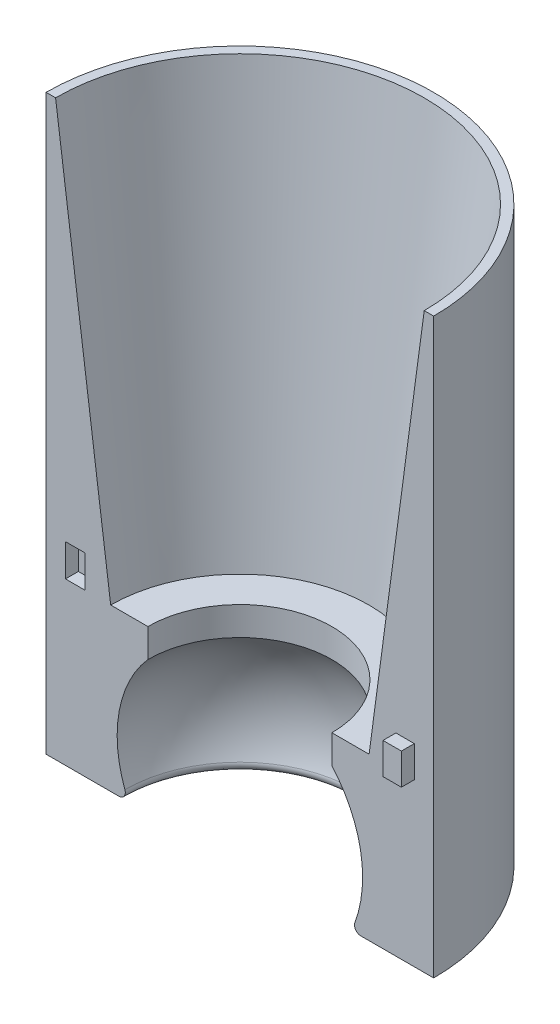
ISO-10303-21;
HEADER;
FILE_DESCRIPTION(('STEP AP214'),'2;1');
FILE_NAME('part.step','',(''),(''),'','','');
FILE_SCHEMA(('AUTOMOTIVE_DESIGN { 1 0 10303 214 1 1 1 1 }'));
ENDSEC;
DATA;
#1=APPLICATION_CONTEXT('core data for automotive mechanical design processes');
#2=APPLICATION_PROTOCOL_DEFINITION('international standard','automotive_design',2000,#1);
#3=PRODUCT_CONTEXT('',#1,'mechanical');
#4=PRODUCT('Part','Part','',(#3));
#5=PRODUCT_RELATED_PRODUCT_CATEGORY('part','',(#4));
#6=PRODUCT_DEFINITION_FORMATION('','',#4);
#7=PRODUCT_DEFINITION_CONTEXT('part definition',#1,'design');
#8=PRODUCT_DEFINITION('design','',#6,#7);
#9=PRODUCT_DEFINITION_SHAPE('','',#8);
#10=(LENGTH_UNIT() NAMED_UNIT(*) SI_UNIT(.MILLI.,.METRE.));
#11=(NAMED_UNIT(*) PLANE_ANGLE_UNIT() SI_UNIT($,.RADIAN.));
#12=(NAMED_UNIT(*) SI_UNIT($,.STERADIAN.) SOLID_ANGLE_UNIT());
#13=UNCERTAINTY_MEASURE_WITH_UNIT(LENGTH_MEASURE(1.E-05),#10,'distance_accuracy_value','');
#14=(GEOMETRIC_REPRESENTATION_CONTEXT(3) GLOBAL_UNCERTAINTY_ASSIGNED_CONTEXT((#13)) GLOBAL_UNIT_ASSIGNED_CONTEXT((#10,
#11,#12)) REPRESENTATION_CONTEXT('',''));
#15=CARTESIAN_POINT('',(0.,0.,0.));
#16=DIRECTION('',(0.,0.,1.));
#17=DIRECTION('',(1.,0.,0.));
#18=AXIS2_PLACEMENT_3D('',#15,#16,#17);
#19=CARTESIAN_POINT('',(-18.2557556450827,0.,0.));
#20=DIRECTION('',(0.,0.,-1.));
#21=DIRECTION('',(-1.,0.,0.));
#22=AXIS2_PLACEMENT_3D('',#19,#20,#21);
#23=PLANE('',#22);
#24=CARTESIAN_POINT('',(-9.12787782254135,-5.79954606428158,0.));
#25=DIRECTION('',(0.,0.,-1.));
#26=DIRECTION('',(-1.,0.,0.));
#27=AXIS2_PLACEMENT_3D('',#24,#25,#26);
#28=CIRCLE('',#27,19.);
#29=CARTESIAN_POINT('',(5.11503764192683,6.77580121012851,0.));
#30=VERTEX_POINT('',#29);
#31=CARTESIAN_POINT('',(8.67036647289408,-12.4495460642816,1.24284475643368E-13));
#32=VERTEX_POINT('',#31);
#33=EDGE_CURVE('E242',#30,#32,#28,.T.);
#34=ORIENTED_EDGE('',*,*,#33,.T.);
#35=CARTESIAN_POINT('',(9.60711617265384,-12.7995460642816,1.30825763835124E-13));
#36=DIRECTION('',(0.,0.,-1.));
#37=DIRECTION('',(-1.,0.,0.));
#38=AXIS2_PLACEMENT_3D('',#35,#36,#37);
#39=CIRCLE('',#38,1.);
#40=CARTESIAN_POINT('',(9.60711617265384,-13.7995460642816,1.30825763835124E-13));
#41=VERTEX_POINT('',#40);
#42=EDGE_CURVE('E11',#32,#41,#39,.F.);
#43=ORIENTED_EDGE('',*,*,#42,.T.);
#44=DIRECTION('',(1.,0.,0.));
#45=VECTOR('',#44,1.);
#46=CARTESIAN_POINT('',(-18.2557556450827,-13.7995460642816,0.));
#47=LINE('',#46,#45);
#48=CARTESIAN_POINT('',(20.8721221774586,-13.7995460642816,2.09488880330588E-13));
#49=VERTEX_POINT('',#48);
#50=EDGE_CURVE('E259',#41,#49,#47,.T.);
#51=ORIENTED_EDGE('',*,*,#50,.T.);
#52=DIRECTION('',(0.,1.,0.));
#53=VECTOR('',#52,1.);
#54=CARTESIAN_POINT('',(20.8721221774586,0.,2.09488880330588E-13));
#55=LINE('',#54,#53);
#56=CARTESIAN_POINT('',(20.8721221774586,74.9367459600028,2.09488880330588E-13));
#57=VERTEX_POINT('',#56);
#58=EDGE_CURVE('E256',#49,#57,#55,.T.);
#59=ORIENTED_EDGE('',*,*,#58,.T.);
#60=DIRECTION('',(1.,0.,0.));
#61=VECTOR('',#60,1.);
#62=CARTESIAN_POINT('',(-18.2557556450827,74.9367459600028,0.));
#63=LINE('',#62,#61);
#64=CARTESIAN_POINT('',(19.404475428781,74.9367459600028,1.99240357860544E-13));
#65=VERTEX_POINT('',#64);
#66=EDGE_CURVE('E253',#65,#57,#63,.T.);
#67=ORIENTED_EDGE('',*,*,#66,.F.);
#68=DIRECTION('',(0.132679417219069,0.991159004522689,0.));
#69=VECTOR('',#68,1.);
#70=CARTESIAN_POINT('',(8.88684958696146,-3.63338780918319,1.2579616914925E-13));
#71=LINE('',#70,#69);
#72=CARTESIAN_POINT('',(10.8725506388136,11.2004539357184,1.39662245483376E-13));
#73=VERTEX_POINT('',#72);
#74=EDGE_CURVE('E250',#73,#65,#71,.T.);
#75=ORIENTED_EDGE('',*,*,#74,.F.);
#76=DIRECTION('',(1.,0.,0.));
#77=VECTOR('',#76,1.);
#78=CARTESIAN_POINT('',(-18.2557556450827,11.2004539357184,0.));
#79=LINE('',#78,#77);
#80=CARTESIAN_POINT('',(5.11503764192682,11.2004539357184,0.));
#81=VERTEX_POINT('',#80);
#82=EDGE_CURVE('E247',#81,#73,#79,.T.);
#83=ORIENTED_EDGE('',*,*,#82,.F.);
#84=DIRECTION('',(0.,-1.,0.));
#85=VECTOR('',#84,1.);
#86=CARTESIAN_POINT('',(5.11503764192683,0.,0.));
#87=LINE('',#86,#85);
#88=EDGE_CURVE('E244',#81,#30,#87,.T.);
#89=ORIENTED_EDGE('',*,*,#88,.T.);
#90=EDGE_LOOP('',(#34,#43,#51,#59,#67,#75,#83,#89));
#91=FACE_BOUND('',#90,.T.);
#92=DIRECTION('',(0.,-1.,0.));
#93=VECTOR('',#92,1.);
#94=CARTESIAN_POINT('',(15.0221221774586,16.1254539357184,0.));
#95=LINE('',#94,#93);
#96=CARTESIAN_POINT('',(15.0221221774586,16.1254539357184,0.));
#97=VERTEX_POINT('',#96);
#98=CARTESIAN_POINT('',(15.0221221774586,11.2754539357184,1.68638548666123E-13));
#99=VERTEX_POINT('',#98);
#100=EDGE_CURVE('E187',#97,#99,#95,.T.);
#101=ORIENTED_EDGE('',*,*,#100,.F.);
#102=DIRECTION('',(-1.,0.,0.));
#103=VECTOR('',#102,1.);
#104=CARTESIAN_POINT('',(15.0221221774586,16.1254539357184,0.));
#105=LINE('',#104,#103);
#106=CARTESIAN_POINT('',(17.8721221774586,16.1254539357184,1.88539992297529E-13));
#107=VERTEX_POINT('',#106);
#108=EDGE_CURVE('E195',#107,#97,#105,.T.);
#109=ORIENTED_EDGE('',*,*,#108,.F.);
#110=DIRECTION('',(0.,1.,0.));
#111=VECTOR('',#110,1.);
#112=CARTESIAN_POINT('',(17.8721221774586,16.1254539357184,0.));
#113=LINE('',#112,#111);
#114=CARTESIAN_POINT('',(17.8721221774586,11.2754539357184,1.88539992297529E-13));
#115=VERTEX_POINT('',#114);
#116=EDGE_CURVE('E207',#115,#107,#113,.T.);
#117=ORIENTED_EDGE('',*,*,#116,.F.);
#118=DIRECTION('',(1.,0.,0.));
#119=VECTOR('',#118,1.);
#120=CARTESIAN_POINT('',(15.0221221774586,11.2754539357184,0.));
#121=LINE('',#120,#119);
#122=EDGE_CURVE('E204',#99,#115,#121,.T.);
#123=ORIENTED_EDGE('',*,*,#122,.F.);
#124=EDGE_LOOP('',(#101,#109,#117,#123));
#125=FACE_BOUND('',#124,.T.);
#126=ADVANCED_FACE('F35',(#91,#125),#23,.F.);
#127=CARTESIAN_POINT('',(-9.12787782254135,-5.79954606428158,0.));
#128=DIRECTION('',(0.,1.,0.));
#129=DIRECTION('',(1.,0.,0.));
#130=AXIS2_PLACEMENT_3D('',#127,#128,#129);
#131=SPHERICAL_SURFACE('',#130,19.);
#132=CARTESIAN_POINT('',(-9.12787782254136,-5.79954606428158,0.));
#133=DIRECTION('',(0.,0.,1.));
#134=DIRECTION('',(1.,0.,0.));
#135=AXIS2_PLACEMENT_3D('',#132,#133,#134);
#136=CIRCLE('',#135,19.);
#137=CARTESIAN_POINT('',(-23.3707932870095,6.77580121012851,0.));
#138=VERTEX_POINT('',#137);
#139=CARTESIAN_POINT('',(-26.9261221179768,-12.4495460642816,0.));
#140=VERTEX_POINT('',#139);
#141=EDGE_CURVE('E223',#138,#140,#136,.T.);
#142=ORIENTED_EDGE('',*,*,#141,.T.);
#143=CARTESIAN_POINT('',(-9.12787782254135,-12.4495460642816,0.));
#144=DIRECTION('',(0.,1.,0.));
#145=DIRECTION('',(-1.,0.,0.));
#146=AXIS2_PLACEMENT_3D('',#143,#144,#145);
#147=CIRCLE('',#146,17.7982442954354);
#148=EDGE_CURVE('E43',#140,#32,#147,.F.);
#149=ORIENTED_EDGE('',*,*,#148,.T.);
#150=ORIENTED_EDGE('',*,*,#33,.F.);
#151=CARTESIAN_POINT('',(-9.12787782254135,6.77580121012851,0.));
#152=DIRECTION('',(0.,1.,0.));
#153=DIRECTION('',(-1.,0.,0.));
#154=AXIS2_PLACEMENT_3D('',#151,#152,#153);
#155=CIRCLE('',#154,14.2429154644682);
#156=EDGE_CURVE('E272',#30,#138,#155,.T.);
#157=ORIENTED_EDGE('',*,*,#156,.T.);
#158=EDGE_LOOP('',(#142,#149,#150,#157));
#159=FACE_BOUND('',#158,.T.);
#160=ADVANCED_FACE('F300',(#159),#131,.F.);
#161=CARTESIAN_POINT('',(-9.12787782254136,95.8584641843645,0.));
#162=DIRECTION('',(0.,1.,0.));
#163=DIRECTION('',(-1.,0.,0.));
#164=AXIS2_PLACEMENT_3D('',#161,#162,#163);
#165=CYLINDRICAL_SURFACE('',#164,14.2429154644682);
#166=CARTESIAN_POINT('',(-9.12787782254135,11.2004539357184,0.));
#167=DIRECTION('',(0.,1.,0.));
#168=DIRECTION('',(-1.,0.,0.));
#169=AXIS2_PLACEMENT_3D('',#166,#167,#168);
#170=CIRCLE('',#169,14.2429154644682);
#171=CARTESIAN_POINT('',(-23.3707932870095,11.2004539357184,0.));
#172=VERTEX_POINT('',#171);
#173=EDGE_CURVE('E270',#81,#172,#170,.T.);
#174=ORIENTED_EDGE('',*,*,#173,.T.);
#175=DIRECTION('',(0.,-1.,0.));
#176=VECTOR('',#175,1.);
#177=CARTESIAN_POINT('',(-23.3707932870095,0.,0.));
#178=LINE('',#177,#176);
#179=EDGE_CURVE('E225',#172,#138,#178,.T.);
#180=ORIENTED_EDGE('',*,*,#179,.T.);
#181=ORIENTED_EDGE('',*,*,#156,.F.);
#182=ORIENTED_EDGE('',*,*,#88,.F.);
#183=EDGE_LOOP('',(#174,#180,#181,#182));
#184=FACE_BOUND('',#183,.T.);
#185=ADVANCED_FACE('F305',(#184),#165,.F.);
#186=CARTESIAN_POINT('',(-18.2557556450827,11.2004539357184,0.));
#187=DIRECTION('',(0.,1.,0.));
#188=DIRECTION('',(-1.,0.,0.));
#189=AXIS2_PLACEMENT_3D('',#186,#187,#188);
#190=PLANE('',#189);
#191=CARTESIAN_POINT('',(-9.12787782254135,11.2004539357184,0.));
#192=DIRECTION('',(0.,1.,0.));
#193=DIRECTION('',(-1.,0.,0.));
#194=AXIS2_PLACEMENT_3D('',#191,#192,#193);
#195=CIRCLE('',#194,20.000428461355);
#196=CARTESIAN_POINT('',(-29.1283062838963,11.2004539357184,0.));
#197=VERTEX_POINT('',#196);
#198=EDGE_CURVE('E268',#73,#197,#195,.T.);
#199=ORIENTED_EDGE('',*,*,#198,.T.);
#200=DIRECTION('',(-1.,0.,0.));
#201=VECTOR('',#200,1.);
#202=CARTESIAN_POINT('',(0.,11.2004539357184,0.));
#203=LINE('',#202,#201);
#204=EDGE_CURVE('E228',#172,#197,#203,.T.);
#205=ORIENTED_EDGE('',*,*,#204,.F.);
#206=ORIENTED_EDGE('',*,*,#173,.F.);
#207=ORIENTED_EDGE('',*,*,#82,.T.);
#208=EDGE_LOOP('',(#199,#205,#206,#207));
#209=FACE_BOUND('',#208,.T.);
#210=ADVANCED_FACE('F321',(#209),#190,.T.);
#211=CARTESIAN_POINT('',(-9.12787782254135,11.2004539357184,0.));
#212=DIRECTION('',(0.,1.,0.));
#213=DIRECTION('',(-1.,0.,0.));
#214=AXIS2_PLACEMENT_3D('',#211,#212,#213);
#215=CONICAL_SURFACE('',#214,20.000428461355,0.133071811274571);
#216=CARTESIAN_POINT('',(-9.12787782254136,74.9367459600028,0.));
#217=DIRECTION('',(0.,1.,0.));
#218=DIRECTION('',(-1.,0.,0.));
#219=AXIS2_PLACEMENT_3D('',#216,#217,#218);
#220=CIRCLE('',#219,28.5323532513223);
#221=CARTESIAN_POINT('',(-37.6602310738637,74.9367459600028,0.));
#222=VERTEX_POINT('',#221);
#223=EDGE_CURVE('E266',#65,#222,#220,.T.);
#224=ORIENTED_EDGE('',*,*,#223,.T.);
#225=DIRECTION('',(-0.13267941721907,0.991159004522689,0.));
#226=VECTOR('',#225,1.);
#227=CARTESIAN_POINT('',(-27.1426052320442,-3.63338780918319,0.));
#228=LINE('',#227,#226);
#229=EDGE_CURVE('E231',#197,#222,#228,.T.);
#230=ORIENTED_EDGE('',*,*,#229,.F.);
#231=ORIENTED_EDGE('',*,*,#198,.F.);
#232=ORIENTED_EDGE('',*,*,#74,.T.);
#233=EDGE_LOOP('',(#224,#230,#231,#232));
#234=FACE_BOUND('',#233,.T.);
#235=ADVANCED_FACE('F317',(#234),#215,.F.);
#236=CARTESIAN_POINT('',(-18.2557556450827,74.9367459600028,0.));
#237=DIRECTION('',(0.,1.,0.));
#238=DIRECTION('',(-1.,0.,0.));
#239=AXIS2_PLACEMENT_3D('',#236,#237,#238);
#240=PLANE('',#239);
#241=CARTESIAN_POINT('',(-9.12787782254136,74.9367459600028,0.));
#242=DIRECTION('',(0.,1.,0.));
#243=DIRECTION('',(-1.,0.,0.));
#244=AXIS2_PLACEMENT_3D('',#241,#242,#243);
#245=CIRCLE('',#244,30.);
#246=CARTESIAN_POINT('',(-39.1278778225414,74.9367459600028,0.));
#247=VERTEX_POINT('',#246);
#248=EDGE_CURVE('E264',#57,#247,#245,.T.);
#249=ORIENTED_EDGE('',*,*,#248,.T.);
#250=DIRECTION('',(-1.,0.,0.));
#251=VECTOR('',#250,1.);
#252=CARTESIAN_POINT('',(0.,74.9367459600028,0.));
#253=LINE('',#252,#251);
#254=EDGE_CURVE('E234',#222,#247,#253,.T.);
#255=ORIENTED_EDGE('',*,*,#254,.F.);
#256=ORIENTED_EDGE('',*,*,#223,.F.);
#257=ORIENTED_EDGE('',*,*,#66,.T.);
#258=EDGE_LOOP('',(#249,#255,#256,#257));
#259=FACE_BOUND('',#258,.T.);
#260=ADVANCED_FACE('F314',(#259),#240,.T.);
#261=CARTESIAN_POINT('',(-9.12787782254136,95.8584641843645,0.));
#262=DIRECTION('',(0.,1.,0.));
#263=DIRECTION('',(-1.,0.,0.));
#264=AXIS2_PLACEMENT_3D('',#261,#262,#263);
#265=CYLINDRICAL_SURFACE('',#264,30.);
#266=CARTESIAN_POINT('',(-9.12787782254135,-13.7995460642816,0.));
#267=DIRECTION('',(0.,1.,0.));
#268=DIRECTION('',(-1.,0.,0.));
#269=AXIS2_PLACEMENT_3D('',#266,#267,#268);
#270=CIRCLE('',#269,30.);
#271=CARTESIAN_POINT('',(-39.1278778225414,-13.7995460642816,0.));
#272=VERTEX_POINT('',#271);
#273=EDGE_CURVE('E261',#49,#272,#270,.T.);
#274=ORIENTED_EDGE('',*,*,#273,.T.);
#275=DIRECTION('',(0.,1.,0.));
#276=VECTOR('',#275,1.);
#277=CARTESIAN_POINT('',(-39.1278778225414,0.,0.));
#278=LINE('',#277,#276);
#279=EDGE_CURVE('E237',#272,#247,#278,.T.);
#280=ORIENTED_EDGE('',*,*,#279,.T.);
#281=ORIENTED_EDGE('',*,*,#248,.F.);
#282=ORIENTED_EDGE('',*,*,#58,.F.);
#283=EDGE_LOOP('',(#274,#280,#281,#282));
#284=FACE_BOUND('',#283,.T.);
#285=ADVANCED_FACE('F288',(#284),#265,.T.);
#286=CARTESIAN_POINT('',(-18.2557556450827,-13.7995460642816,0.));
#287=DIRECTION('',(0.,1.,0.));
#288=DIRECTION('',(-1.,0.,0.));
#289=AXIS2_PLACEMENT_3D('',#286,#287,#288);
#290=PLANE('',#289);
#291=ORIENTED_EDGE('',*,*,#50,.F.);
#292=CARTESIAN_POINT('',(-9.12787782254135,-13.7995460642816,0.));
#293=DIRECTION('',(0.,1.,0.));
#294=DIRECTION('',(-1.,0.,0.));
#295=AXIS2_PLACEMENT_3D('',#292,#293,#294);
#296=CIRCLE('',#295,18.7349939951952);
#297=CARTESIAN_POINT('',(-27.8628718177365,-13.7995460642816,0.));
#298=VERTEX_POINT('',#297);
#299=EDGE_CURVE('E274',#41,#298,#296,.T.);
#300=ORIENTED_EDGE('',*,*,#299,.T.);
#301=DIRECTION('',(-1.,0.,0.));
#302=VECTOR('',#301,1.);
#303=CARTESIAN_POINT('',(0.,-13.7995460642816,0.));
#304=LINE('',#303,#302);
#305=EDGE_CURVE('E240',#298,#272,#304,.T.);
#306=ORIENTED_EDGE('',*,*,#305,.T.);
#307=ORIENTED_EDGE('',*,*,#273,.F.);
#308=EDGE_LOOP('',(#291,#300,#306,#307));
#309=FACE_BOUND('',#308,.T.);
#310=ADVANCED_FACE('F280',(#309),#290,.F.);
#311=CARTESIAN_POINT('',(0.,0.,0.));
#312=DIRECTION('',(0.,0.,1.));
#313=DIRECTION('',(1.,0.,0.));
#314=AXIS2_PLACEMENT_3D('',#311,#312,#313);
#315=PLANE('',#314);
#316=DIRECTION('',(0.,-1.,0.));
#317=VECTOR('',#316,1.);
#318=CARTESIAN_POINT('',(-36.1278778225414,16.2004539357184,0.));
#319=LINE('',#318,#317);
#320=CARTESIAN_POINT('',(-36.1278778225414,16.2004539357184,0.));
#321=VERTEX_POINT('',#320);
#322=CARTESIAN_POINT('',(-36.1278778225414,11.2004539357184,0.));
#323=VERTEX_POINT('',#322);
#324=EDGE_CURVE('E155',#321,#323,#319,.T.);
#325=ORIENTED_EDGE('',*,*,#324,.F.);
#326=DIRECTION('',(-1.,0.,0.));
#327=VECTOR('',#326,1.);
#328=CARTESIAN_POINT('',(-36.1278778225414,16.2004539357184,0.));
#329=LINE('',#328,#327);
#330=CARTESIAN_POINT('',(-33.1278778225414,16.2004539357184,0.));
#331=VERTEX_POINT('',#330);
#332=EDGE_CURVE('E172',#331,#321,#329,.T.);
#333=ORIENTED_EDGE('',*,*,#332,.F.);
#334=DIRECTION('',(0.,1.,0.));
#335=VECTOR('',#334,1.);
#336=CARTESIAN_POINT('',(-33.1278778225414,16.2004539357184,0.));
#337=LINE('',#336,#335);
#338=CARTESIAN_POINT('',(-33.1278778225414,11.2004539357184,0.));
#339=VERTEX_POINT('',#338);
#340=EDGE_CURVE('E175',#339,#331,#337,.T.);
#341=ORIENTED_EDGE('',*,*,#340,.F.);
#342=DIRECTION('',(1.,0.,0.));
#343=VECTOR('',#342,1.);
#344=CARTESIAN_POINT('',(-36.1278778225414,11.2004539357184,0.));
#345=LINE('',#344,#343);
#346=EDGE_CURVE('E181',#323,#339,#345,.T.);
#347=ORIENTED_EDGE('',*,*,#346,.F.);
#348=EDGE_LOOP('',(#325,#333,#341,#347));
#349=FACE_BOUND('',#348,.T.);
#350=ORIENTED_EDGE('',*,*,#305,.F.);
#351=CARTESIAN_POINT('',(-27.8628718177365,-12.7995460642816,0.));
#352=DIRECTION('',(0.,0.,1.));
#353=DIRECTION('',(1.,0.,0.));
#354=AXIS2_PLACEMENT_3D('',#351,#352,#353);
#355=CIRCLE('',#354,1.);
#356=EDGE_CURVE('E57',#298,#140,#355,.T.);
#357=ORIENTED_EDGE('',*,*,#356,.T.);
#358=ORIENTED_EDGE('',*,*,#141,.F.);
#359=ORIENTED_EDGE('',*,*,#179,.F.);
#360=ORIENTED_EDGE('',*,*,#204,.T.);
#361=ORIENTED_EDGE('',*,*,#229,.T.);
#362=ORIENTED_EDGE('',*,*,#254,.T.);
#363=ORIENTED_EDGE('',*,*,#279,.F.);
#364=EDGE_LOOP('',(#350,#357,#358,#359,#360,#361,#362,#363));
#365=FACE_BOUND('',#364,.T.);
#366=ADVANCED_FACE('F285',(#349,#365),#315,.T.);
#367=CARTESIAN_POINT('',(15.0221221774586,16.1254539357184,2.));
#368=DIRECTION('',(1.,0.,0.));
#369=DIRECTION('',(0.,0.,-1.));
#370=AXIS2_PLACEMENT_3D('',#367,#368,#369);
#371=PLANE('',#370);
#372=ORIENTED_EDGE('',*,*,#100,.T.);
#373=DIRECTION('',(0.,0.,-1.));
#374=VECTOR('',#373,1.);
#375=CARTESIAN_POINT('',(15.0221221774586,11.2754539357184,2.));
#376=LINE('',#375,#374);
#377=CARTESIAN_POINT('',(15.0221221774586,11.2754539357184,2.));
#378=VERTEX_POINT('',#377);
#379=EDGE_CURVE('E220',#378,#99,#376,.T.);
#380=ORIENTED_EDGE('',*,*,#379,.F.);
#381=DIRECTION('',(0.,-1.,0.));
#382=VECTOR('',#381,1.);
#383=CARTESIAN_POINT('',(15.0221221774586,16.1254539357184,2.));
#384=LINE('',#383,#382);
#385=CARTESIAN_POINT('',(15.0221221774586,16.1254539357184,2.));
#386=VERTEX_POINT('',#385);
#387=EDGE_CURVE('E191',#386,#378,#384,.T.);
#388=ORIENTED_EDGE('',*,*,#387,.F.);
#389=DIRECTION('',(0.,0.,-1.));
#390=VECTOR('',#389,1.);
#391=CARTESIAN_POINT('',(15.0221221774586,16.1254539357184,2.));
#392=LINE('',#391,#390);
#393=EDGE_CURVE('E201',#386,#97,#392,.T.);
#394=ORIENTED_EDGE('',*,*,#393,.T.);
#395=EDGE_LOOP('',(#372,#380,#388,#394));
#396=FACE_BOUND('',#395,.T.);
#397=ADVANCED_FACE('F363',(#396),#371,.F.);
#398=CARTESIAN_POINT('',(15.0221221774586,11.2754539357184,2.));
#399=DIRECTION('',(0.,1.,0.));
#400=DIRECTION('',(-1.,0.,0.));
#401=AXIS2_PLACEMENT_3D('',#398,#399,#400);
#402=PLANE('',#401);
#403=ORIENTED_EDGE('',*,*,#122,.T.);
#404=DIRECTION('',(0.,0.,-1.));
#405=VECTOR('',#404,1.);
#406=CARTESIAN_POINT('',(17.8721221774586,11.2754539357184,2.));
#407=LINE('',#406,#405);
#408=CARTESIAN_POINT('',(17.8721221774586,11.2754539357184,2.));
#409=VERTEX_POINT('',#408);
#410=EDGE_CURVE('E217',#409,#115,#407,.T.);
#411=ORIENTED_EDGE('',*,*,#410,.F.);
#412=DIRECTION('',(1.,0.,0.));
#413=VECTOR('',#412,1.);
#414=CARTESIAN_POINT('',(15.0221221774586,11.2754539357184,2.));
#415=LINE('',#414,#413);
#416=EDGE_CURVE('E194',#378,#409,#415,.T.);
#417=ORIENTED_EDGE('',*,*,#416,.F.);
#418=ORIENTED_EDGE('',*,*,#379,.T.);
#419=EDGE_LOOP('',(#403,#411,#417,#418));
#420=FACE_BOUND('',#419,.T.);
#421=ADVANCED_FACE('F369',(#420),#402,.F.);
#422=CARTESIAN_POINT('',(17.8721221774586,16.1254539357184,2.));
#423=DIRECTION('',(-1.,0.,0.));
#424=DIRECTION('',(0.,0.,1.));
#425=AXIS2_PLACEMENT_3D('',#422,#423,#424);
#426=PLANE('',#425);
#427=ORIENTED_EDGE('',*,*,#116,.T.);
#428=DIRECTION('',(0.,0.,-1.));
#429=VECTOR('',#428,1.);
#430=CARTESIAN_POINT('',(17.8721221774586,16.1254539357184,2.));
#431=LINE('',#430,#429);
#432=CARTESIAN_POINT('',(17.8721221774586,16.1254539357184,2.));
#433=VERTEX_POINT('',#432);
#434=EDGE_CURVE('E214',#433,#107,#431,.T.);
#435=ORIENTED_EDGE('',*,*,#434,.F.);
#436=DIRECTION('',(0.,1.,0.));
#437=VECTOR('',#436,1.);
#438=CARTESIAN_POINT('',(17.8721221774586,16.1254539357184,2.));
#439=LINE('',#438,#437);
#440=EDGE_CURVE('E197',#409,#433,#439,.T.);
#441=ORIENTED_EDGE('',*,*,#440,.F.);
#442=ORIENTED_EDGE('',*,*,#410,.T.);
#443=EDGE_LOOP('',(#427,#435,#441,#442));
#444=FACE_BOUND('',#443,.T.);
#445=ADVANCED_FACE('F376',(#444),#426,.F.);
#446=CARTESIAN_POINT('',(15.0221221774586,16.1254539357184,2.));
#447=DIRECTION('',(0.,-1.,0.));
#448=DIRECTION('',(1.,0.,0.));
#449=AXIS2_PLACEMENT_3D('',#446,#447,#448);
#450=PLANE('',#449);
#451=ORIENTED_EDGE('',*,*,#108,.T.);
#452=ORIENTED_EDGE('',*,*,#393,.F.);
#453=DIRECTION('',(-1.,0.,0.));
#454=VECTOR('',#453,1.);
#455=CARTESIAN_POINT('',(15.0221221774586,16.1254539357184,2.));
#456=LINE('',#455,#454);
#457=EDGE_CURVE('E199',#433,#386,#456,.T.);
#458=ORIENTED_EDGE('',*,*,#457,.F.);
#459=ORIENTED_EDGE('',*,*,#434,.T.);
#460=EDGE_LOOP('',(#451,#452,#458,#459));
#461=FACE_BOUND('',#460,.T.);
#462=ADVANCED_FACE('F384',(#461),#450,.F.);
#463=CARTESIAN_POINT('',(0.,0.,2.));
#464=DIRECTION('',(0.,0.,1.));
#465=DIRECTION('',(1.,0.,0.));
#466=AXIS2_PLACEMENT_3D('',#463,#464,#465);
#467=PLANE('',#466);
#468=ORIENTED_EDGE('',*,*,#387,.T.);
#469=ORIENTED_EDGE('',*,*,#416,.T.);
#470=ORIENTED_EDGE('',*,*,#440,.T.);
#471=ORIENTED_EDGE('',*,*,#457,.T.);
#472=EDGE_LOOP('',(#468,#469,#470,#471));
#473=FACE_BOUND('',#472,.T.);
#474=ADVANCED_FACE('F392',(#473),#467,.T.);
#475=CARTESIAN_POINT('',(-36.1278778225414,16.2004539357184,-2.));
#476=DIRECTION('',(-1.,0.,0.));
#477=DIRECTION('',(0.,0.,1.));
#478=AXIS2_PLACEMENT_3D('',#475,#476,#477);
#479=PLANE('',#478);
#480=ORIENTED_EDGE('',*,*,#324,.T.);
#481=DIRECTION('',(0.,0.,1.));
#482=VECTOR('',#481,1.);
#483=CARTESIAN_POINT('',(-36.1278778225414,11.2004539357184,-2.));
#484=LINE('',#483,#482);
#485=CARTESIAN_POINT('',(-36.1278778225414,11.2004539357184,-2.));
#486=VERTEX_POINT('',#485);
#487=EDGE_CURVE('E148',#486,#323,#484,.T.);
#488=ORIENTED_EDGE('',*,*,#487,.F.);
#489=DIRECTION('',(0.,-1.,0.));
#490=VECTOR('',#489,1.);
#491=CARTESIAN_POINT('',(-36.1278778225414,16.2004539357184,-2.));
#492=LINE('',#491,#490);
#493=CARTESIAN_POINT('',(-36.1278778225414,16.2004539357184,-2.));
#494=VERTEX_POINT('',#493);
#495=EDGE_CURVE('E152',#494,#486,#492,.T.);
#496=ORIENTED_EDGE('',*,*,#495,.F.);
#497=DIRECTION('',(0.,0.,1.));
#498=VECTOR('',#497,1.);
#499=CARTESIAN_POINT('',(-36.1278778225414,16.2004539357184,-2.));
#500=LINE('',#499,#498);
#501=EDGE_CURVE('E185',#494,#321,#500,.T.);
#502=ORIENTED_EDGE('',*,*,#501,.T.);
#503=EDGE_LOOP('',(#480,#488,#496,#502));
#504=FACE_BOUND('',#503,.T.);
#505=ADVANCED_FACE('F150',(#504),#479,.F.);
#506=CARTESIAN_POINT('',(-36.1278778225414,16.2004539357184,-2.));
#507=DIRECTION('',(0.,1.,0.));
#508=DIRECTION('',(0.,0.,1.));
#509=AXIS2_PLACEMENT_3D('',#506,#507,#508);
#510=PLANE('',#509);
#511=ORIENTED_EDGE('',*,*,#332,.T.);
#512=ORIENTED_EDGE('',*,*,#501,.F.);
#513=DIRECTION('',(-1.,0.,0.));
#514=VECTOR('',#513,1.);
#515=CARTESIAN_POINT('',(-36.1278778225414,16.2004539357184,-2.));
#516=LINE('',#515,#514);
#517=CARTESIAN_POINT('',(-33.1278778225414,16.2004539357184,-2.));
#518=VERTEX_POINT('',#517);
#519=EDGE_CURVE('E160',#518,#494,#516,.T.);
#520=ORIENTED_EDGE('',*,*,#519,.F.);
#521=DIRECTION('',(0.,0.,1.));
#522=VECTOR('',#521,1.);
#523=CARTESIAN_POINT('',(-33.1278778225414,16.2004539357184,-2.));
#524=LINE('',#523,#522);
#525=EDGE_CURVE('E188',#518,#331,#524,.T.);
#526=ORIENTED_EDGE('',*,*,#525,.T.);
#527=EDGE_LOOP('',(#511,#512,#520,#526));
#528=FACE_BOUND('',#527,.T.);
#529=ADVANCED_FACE('F407',(#528),#510,.F.);
#530=CARTESIAN_POINT('',(-33.1278778225414,16.2004539357184,-2.));
#531=DIRECTION('',(1.,0.,0.));
#532=DIRECTION('',(0.,0.,-1.));
#533=AXIS2_PLACEMENT_3D('',#530,#531,#532);
#534=PLANE('',#533);
#535=ORIENTED_EDGE('',*,*,#340,.T.);
#536=ORIENTED_EDGE('',*,*,#525,.F.);
#537=DIRECTION('',(0.,1.,0.));
#538=VECTOR('',#537,1.);
#539=CARTESIAN_POINT('',(-33.1278778225414,16.2004539357184,-2.));
#540=LINE('',#539,#538);
#541=CARTESIAN_POINT('',(-33.1278778225414,11.2004539357184,-2.));
#542=VERTEX_POINT('',#541);
#543=EDGE_CURVE('E168',#542,#518,#540,.T.);
#544=ORIENTED_EDGE('',*,*,#543,.F.);
#545=DIRECTION('',(0.,0.,1.));
#546=VECTOR('',#545,1.);
#547=CARTESIAN_POINT('',(-33.1278778225414,11.2004539357184,-2.));
#548=LINE('',#547,#546);
#549=EDGE_CURVE('E159',#542,#339,#548,.T.);
#550=ORIENTED_EDGE('',*,*,#549,.T.);
#551=EDGE_LOOP('',(#535,#536,#544,#550));
#552=FACE_BOUND('',#551,.T.);
#553=ADVANCED_FACE('F414',(#552),#534,.F.);
#554=CARTESIAN_POINT('',(-36.1278778225414,11.2004539357184,-2.));
#555=DIRECTION('',(0.,-1.,0.));
#556=DIRECTION('',(0.,0.,-1.));
#557=AXIS2_PLACEMENT_3D('',#554,#555,#556);
#558=PLANE('',#557);
#559=ORIENTED_EDGE('',*,*,#346,.T.);
#560=ORIENTED_EDGE('',*,*,#549,.F.);
#561=DIRECTION('',(1.,0.,0.));
#562=VECTOR('',#561,1.);
#563=CARTESIAN_POINT('',(-36.1278778225414,11.2004539357184,-2.));
#564=LINE('',#563,#562);
#565=EDGE_CURVE('E163',#486,#542,#564,.T.);
#566=ORIENTED_EDGE('',*,*,#565,.F.);
#567=ORIENTED_EDGE('',*,*,#487,.T.);
#568=EDGE_LOOP('',(#559,#560,#566,#567));
#569=FACE_BOUND('',#568,.T.);
#570=ADVANCED_FACE('F164',(#569),#558,.F.);
#571=CARTESIAN_POINT('',(0.,0.,-2.));
#572=DIRECTION('',(0.,0.,1.));
#573=DIRECTION('',(1.,0.,0.));
#574=AXIS2_PLACEMENT_3D('',#571,#572,#573);
#575=PLANE('',#574);
#576=ORIENTED_EDGE('',*,*,#495,.T.);
#577=ORIENTED_EDGE('',*,*,#565,.T.);
#578=ORIENTED_EDGE('',*,*,#543,.T.);
#579=ORIENTED_EDGE('',*,*,#519,.T.);
#580=EDGE_LOOP('',(#576,#577,#578,#579));
#581=FACE_BOUND('',#580,.T.);
#582=ADVANCED_FACE('F170',(#581),#575,.T.);
#583=CARTESIAN_POINT('',(-9.12787782254135,-12.7995460642816,0.));
#584=DIRECTION('',(0.,1.,0.));
#585=DIRECTION('',(-1.,0.,0.));
#586=AXIS2_PLACEMENT_3D('',#583,#584,#585);
#587=TOROIDAL_SURFACE('',#586,18.7349939951952,1.);
#588=ORIENTED_EDGE('',*,*,#42,.F.);
#589=ORIENTED_EDGE('',*,*,#148,.F.);
#590=ORIENTED_EDGE('',*,*,#356,.F.);
#591=ORIENTED_EDGE('',*,*,#299,.F.);
#592=EDGE_LOOP('',(#588,#589,#590,#591));
#593=FACE_BOUND('',#592,.T.);
#594=ADVANCED_FACE('F37',(#593),#587,.T.);
#595=CLOSED_SHELL('',(#126,#160,#185,#210,#235,#260,#285,#310,#366,#397,#421,#445,#462,#474,
#505,#529,#553,#570,#582,#594));
#596=MANIFOLD_SOLID_BREP('B2',#595);
#597=ADVANCED_BREP_SHAPE_REPRESENTATION('',(#18,#596),#14);
#598=SHAPE_DEFINITION_REPRESENTATION(#9,#597);
ENDSEC;
END-ISO-10303-21;
